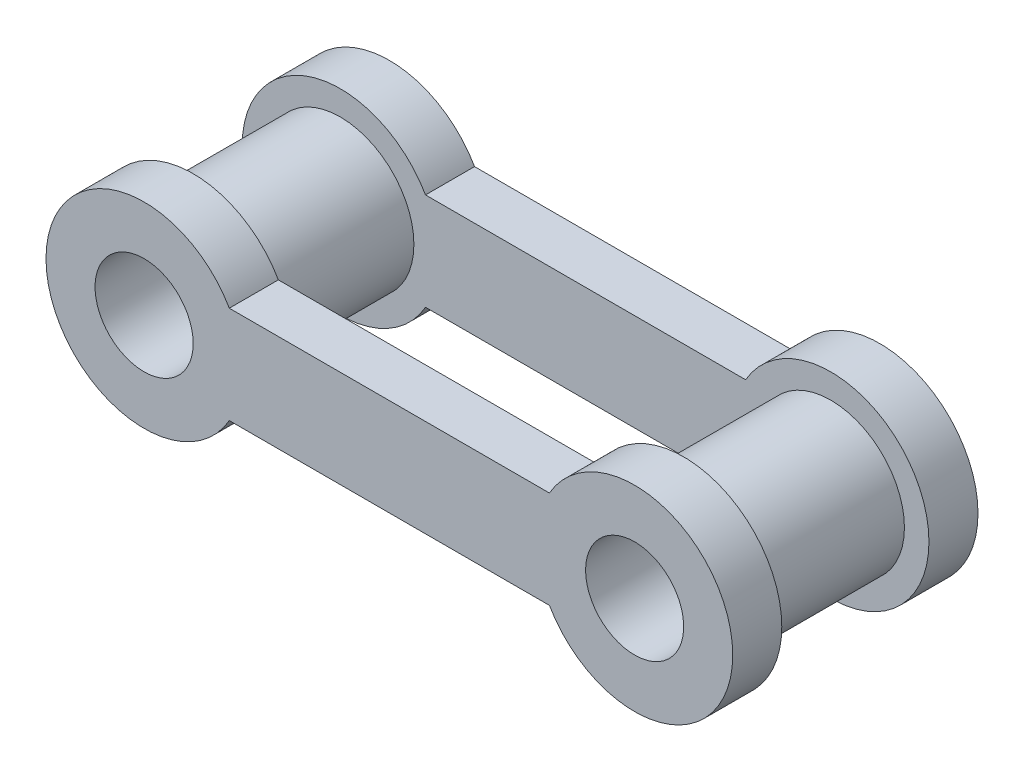
ISO-10303-21;
HEADER;
FILE_DESCRIPTION(('STEP AP214'),'2;1');
FILE_NAME('part.step','',(''),(''),'','','');
FILE_SCHEMA(('AUTOMOTIVE_DESIGN { 1 0 10303 214 1 1 1 1 }'));
ENDSEC;
DATA;
#1=APPLICATION_CONTEXT('core data for automotive mechanical design processes');
#2=APPLICATION_PROTOCOL_DEFINITION('international standard','automotive_design',2000,#1);
#3=PRODUCT_CONTEXT('',#1,'mechanical');
#4=PRODUCT('Part','Part','',(#3));
#5=PRODUCT_RELATED_PRODUCT_CATEGORY('part','',(#4));
#6=PRODUCT_DEFINITION_FORMATION('','',#4);
#7=PRODUCT_DEFINITION_CONTEXT('part definition',#1,'design');
#8=PRODUCT_DEFINITION('design','',#6,#7);
#9=PRODUCT_DEFINITION_SHAPE('','',#8);
#10=(LENGTH_UNIT() NAMED_UNIT(*) SI_UNIT(.MILLI.,.METRE.));
#11=(NAMED_UNIT(*) PLANE_ANGLE_UNIT() SI_UNIT($,.RADIAN.));
#12=(NAMED_UNIT(*) SI_UNIT($,.STERADIAN.) SOLID_ANGLE_UNIT());
#13=UNCERTAINTY_MEASURE_WITH_UNIT(LENGTH_MEASURE(1.E-05),#10,'distance_accuracy_value','');
#14=(GEOMETRIC_REPRESENTATION_CONTEXT(3) GLOBAL_UNCERTAINTY_ASSIGNED_CONTEXT((#13)) GLOBAL_UNIT_ASSIGNED_CONTEXT((#10,
#11,#12)) REPRESENTATION_CONTEXT('',''));
#15=CARTESIAN_POINT('',(0.,0.,0.));
#16=DIRECTION('',(0.,0.,1.));
#17=DIRECTION('',(1.,0.,0.));
#18=AXIS2_PLACEMENT_3D('',#15,#16,#17);
#19=CARTESIAN_POINT('',(-4.12607835068908,1.78539467495371,0.));
#20=DIRECTION('',(0.,0.,1.));
#21=DIRECTION('',(1.,0.,0.));
#22=AXIS2_PLACEMENT_3D('',#19,#20,#21);
#23=PLANE('',#22);
#24=CARTESIAN_POINT('',(15.8739216493109,1.78539467495371,0.));
#25=DIRECTION('',(0.,0.,1.));
#26=DIRECTION('',(1.,0.,0.));
#27=AXIS2_PLACEMENT_3D('',#24,#25,#26);
#28=CIRCLE('',#27,3.);
#29=CARTESIAN_POINT('',(18.8739216493109,1.78539467495371,0.));
#30=VERTEX_POINT('',#29);
#31=EDGE_CURVE('E44',#30,#30,#28,.F.);
#32=ORIENTED_EDGE('',*,*,#31,.F.);
#33=EDGE_LOOP('',(#32));
#34=FACE_BOUND('',#33,.T.);
#35=CARTESIAN_POINT('',(-4.12607835068908,1.78539467495371,0.));
#36=DIRECTION('',(0.,0.,1.));
#37=DIRECTION('',(1.,0.,0.));
#38=AXIS2_PLACEMENT_3D('',#35,#36,#37);
#39=CIRCLE('',#38,4.);
#40=CARTESIAN_POINT('',(-0.652657961034546,3.7691665360134,0.));
#41=VERTEX_POINT('',#40);
#42=CARTESIAN_POINT('',(-0.652657961034547,-0.198377186105968,0.));
#43=VERTEX_POINT('',#42);
#44=EDGE_CURVE('E167',#41,#43,#39,.T.);
#45=ORIENTED_EDGE('',*,*,#44,.F.);
#46=DIRECTION('',(-1.,0.,0.));
#47=VECTOR('',#46,1.);
#48=CARTESIAN_POINT('',(-0.652657961034546,3.7691665360134,0.));
#49=LINE('',#48,#47);
#50=CARTESIAN_POINT('',(12.4005012596564,3.7691665360134,0.));
#51=VERTEX_POINT('',#50);
#52=EDGE_CURVE('E76',#51,#41,#49,.T.);
#53=ORIENTED_EDGE('',*,*,#52,.F.);
#54=CARTESIAN_POINT('',(15.8739216493109,1.78539467495371,0.));
#55=DIRECTION('',(0.,0.,1.));
#56=DIRECTION('',(-1.,0.,0.));
#57=AXIS2_PLACEMENT_3D('',#54,#55,#56);
#58=CIRCLE('',#57,4.);
#59=CARTESIAN_POINT('',(12.4005012596564,-0.198377186105969,0.));
#60=VERTEX_POINT('',#59);
#61=EDGE_CURVE('E70',#60,#51,#58,.T.);
#62=ORIENTED_EDGE('',*,*,#61,.F.);
#63=DIRECTION('',(1.,0.,0.));
#64=VECTOR('',#63,1.);
#65=CARTESIAN_POINT('',(-0.652657961034547,-0.198377186105968,0.));
#66=LINE('',#65,#64);
#67=EDGE_CURVE('E177',#43,#60,#66,.T.);
#68=ORIENTED_EDGE('',*,*,#67,.F.);
#69=EDGE_LOOP('',(#45,#53,#62,#68));
#70=FACE_BOUND('',#69,.T.);
#71=CARTESIAN_POINT('',(-4.12607835068908,1.78539467495371,0.));
#72=DIRECTION('',(0.,0.,1.));
#73=DIRECTION('',(1.,0.,0.));
#74=AXIS2_PLACEMENT_3D('',#71,#72,#73);
#75=CIRCLE('',#74,3.);
#76=CARTESIAN_POINT('',(-1.12607835068908,1.78539467495371,0.));
#77=VERTEX_POINT('',#76);
#78=EDGE_CURVE('E11',#77,#77,#75,.F.);
#79=ORIENTED_EDGE('',*,*,#78,.F.);
#80=EDGE_LOOP('',(#79));
#81=FACE_BOUND('',#80,.T.);
#82=ADVANCED_FACE('F35',(#34,#70,#81),#23,.F.);
#83=CARTESIAN_POINT('',(-4.12607835068908,1.78539467495371,2.));
#84=DIRECTION('',(0.,0.,1.));
#85=DIRECTION('',(1.,0.,0.));
#86=AXIS2_PLACEMENT_3D('',#83,#84,#85);
#87=PLANE('',#86);
#88=CARTESIAN_POINT('',(-4.12607835068908,1.78539467495371,2.));
#89=DIRECTION('',(0.,0.,1.));
#90=DIRECTION('',(1.,0.,0.));
#91=AXIS2_PLACEMENT_3D('',#88,#89,#90);
#92=CIRCLE('',#91,2.);
#93=CARTESIAN_POINT('',(-2.12607835068908,1.78539467495371,2.));
#94=VERTEX_POINT('',#93);
#95=EDGE_CURVE('E164',#94,#94,#92,.T.);
#96=ORIENTED_EDGE('',*,*,#95,.F.);
#97=EDGE_LOOP('',(#96));
#98=FACE_BOUND('',#97,.T.);
#99=CARTESIAN_POINT('',(-4.12607835068908,1.78539467495371,2.));
#100=DIRECTION('',(0.,0.,1.));
#101=DIRECTION('',(1.,0.,0.));
#102=AXIS2_PLACEMENT_3D('',#99,#100,#101);
#103=CIRCLE('',#102,4.);
#104=CARTESIAN_POINT('',(-0.652657961034546,3.7691665360134,2.));
#105=VERTEX_POINT('',#104);
#106=CARTESIAN_POINT('',(-0.652657961034547,-0.198377186105968,2.));
#107=VERTEX_POINT('',#106);
#108=EDGE_CURVE('E168',#105,#107,#103,.T.);
#109=ORIENTED_EDGE('',*,*,#108,.T.);
#110=DIRECTION('',(1.,0.,0.));
#111=VECTOR('',#110,1.);
#112=CARTESIAN_POINT('',(-0.652657961034547,-0.198377186105968,2.));
#113=LINE('',#112,#111);
#114=CARTESIAN_POINT('',(12.4005012596564,-0.198377186105969,2.));
#115=VERTEX_POINT('',#114);
#116=EDGE_CURVE('E84',#107,#115,#113,.T.);
#117=ORIENTED_EDGE('',*,*,#116,.T.);
#118=CARTESIAN_POINT('',(15.8739216493109,1.78539467495371,2.));
#119=DIRECTION('',(0.,0.,1.));
#120=DIRECTION('',(-1.,0.,0.));
#121=AXIS2_PLACEMENT_3D('',#118,#119,#120);
#122=CIRCLE('',#121,4.);
#123=CARTESIAN_POINT('',(12.4005012596564,3.7691665360134,2.));
#124=VERTEX_POINT('',#123);
#125=EDGE_CURVE('E171',#115,#124,#122,.T.);
#126=ORIENTED_EDGE('',*,*,#125,.T.);
#127=DIRECTION('',(-1.,0.,0.));
#128=VECTOR('',#127,1.);
#129=CARTESIAN_POINT('',(-0.652657961034546,3.7691665360134,2.));
#130=LINE('',#129,#128);
#131=EDGE_CURVE('E52',#124,#105,#130,.T.);
#132=ORIENTED_EDGE('',*,*,#131,.T.);
#133=EDGE_LOOP('',(#109,#117,#126,#132));
#134=FACE_BOUND('',#133,.T.);
#135=CARTESIAN_POINT('',(15.8739216493109,1.78539467495371,2.));
#136=DIRECTION('',(0.,0.,1.));
#137=DIRECTION('',(-1.,0.,0.));
#138=AXIS2_PLACEMENT_3D('',#135,#136,#137);
#139=CIRCLE('',#138,2.);
#140=CARTESIAN_POINT('',(13.8739216493109,1.78539467495371,2.));
#141=VERTEX_POINT('',#140);
#142=EDGE_CURVE('E161',#141,#141,#139,.T.);
#143=ORIENTED_EDGE('',*,*,#142,.F.);
#144=EDGE_LOOP('',(#143));
#145=FACE_BOUND('',#144,.T.);
#146=ADVANCED_FACE('F194',(#98,#134,#145),#87,.T.);
#147=CARTESIAN_POINT('',(-4.12607835068908,1.78539467495371,2.));
#148=DIRECTION('',(0.,0.,-1.));
#149=DIRECTION('',(-1.,0.,0.));
#150=AXIS2_PLACEMENT_3D('',#147,#148,#149);
#151=CYLINDRICAL_SURFACE('',#150,4.);
#152=ORIENTED_EDGE('',*,*,#44,.T.);
#153=DIRECTION('',(0.,0.,-1.));
#154=VECTOR('',#153,1.);
#155=CARTESIAN_POINT('',(-0.652657961034547,-0.198377186105968,2.));
#156=LINE('',#155,#154);
#157=EDGE_CURVE('E186',#107,#43,#156,.T.);
#158=ORIENTED_EDGE('',*,*,#157,.F.);
#159=ORIENTED_EDGE('',*,*,#108,.F.);
#160=DIRECTION('',(0.,0.,-1.));
#161=VECTOR('',#160,1.);
#162=CARTESIAN_POINT('',(-0.652657961034546,3.7691665360134,2.));
#163=LINE('',#162,#161);
#164=EDGE_CURVE('E174',#105,#41,#163,.T.);
#165=ORIENTED_EDGE('',*,*,#164,.T.);
#166=EDGE_LOOP('',(#152,#158,#159,#165));
#167=FACE_BOUND('',#166,.T.);
#168=ADVANCED_FACE('F37',(#167),#151,.T.);
#169=CARTESIAN_POINT('',(-0.652657961034547,-0.198377186105968,2.));
#170=DIRECTION('',(0.,1.,0.));
#171=DIRECTION('',(0.,0.,1.));
#172=AXIS2_PLACEMENT_3D('',#169,#170,#171);
#173=PLANE('',#172);
#174=ORIENTED_EDGE('',*,*,#67,.T.);
#175=DIRECTION('',(0.,0.,-1.));
#176=VECTOR('',#175,1.);
#177=CARTESIAN_POINT('',(12.4005012596564,-0.198377186105969,2.));
#178=LINE('',#177,#176);
#179=EDGE_CURVE('E184',#115,#60,#178,.T.);
#180=ORIENTED_EDGE('',*,*,#179,.F.);
#181=ORIENTED_EDGE('',*,*,#116,.F.);
#182=ORIENTED_EDGE('',*,*,#157,.T.);
#183=EDGE_LOOP('',(#174,#180,#181,#182));
#184=FACE_BOUND('',#183,.T.);
#185=ADVANCED_FACE('F230',(#184),#173,.F.);
#186=CARTESIAN_POINT('',(15.8739216493109,1.78539467495371,2.));
#187=DIRECTION('',(0.,0.,-1.));
#188=DIRECTION('',(-1.,0.,0.));
#189=AXIS2_PLACEMENT_3D('',#186,#187,#188);
#190=CYLINDRICAL_SURFACE('',#189,4.);
#191=ORIENTED_EDGE('',*,*,#61,.T.);
#192=DIRECTION('',(0.,0.,-1.));
#193=VECTOR('',#192,1.);
#194=CARTESIAN_POINT('',(12.4005012596564,3.7691665360134,2.));
#195=LINE('',#194,#193);
#196=EDGE_CURVE('E182',#124,#51,#195,.T.);
#197=ORIENTED_EDGE('',*,*,#196,.F.);
#198=ORIENTED_EDGE('',*,*,#125,.F.);
#199=ORIENTED_EDGE('',*,*,#179,.T.);
#200=EDGE_LOOP('',(#191,#197,#198,#199));
#201=FACE_BOUND('',#200,.T.);
#202=ADVANCED_FACE('F228',(#201),#190,.T.);
#203=CARTESIAN_POINT('',(-0.652657961034546,3.7691665360134,2.));
#204=DIRECTION('',(0.,-1.,0.));
#205=DIRECTION('',(0.,0.,-1.));
#206=AXIS2_PLACEMENT_3D('',#203,#204,#205);
#207=PLANE('',#206);
#208=ORIENTED_EDGE('',*,*,#52,.T.);
#209=ORIENTED_EDGE('',*,*,#164,.F.);
#210=ORIENTED_EDGE('',*,*,#131,.F.);
#211=ORIENTED_EDGE('',*,*,#196,.T.);
#212=EDGE_LOOP('',(#208,#209,#210,#211));
#213=FACE_BOUND('',#212,.T.);
#214=ADVANCED_FACE('F221',(#213),#207,.F.);
#215=CARTESIAN_POINT('',(-4.12607835068908,1.78539467495371,2.));
#216=DIRECTION('',(0.,0.,-1.));
#217=DIRECTION('',(-1.,0.,0.));
#218=AXIS2_PLACEMENT_3D('',#215,#216,#217);
#219=CYLINDRICAL_SURFACE('',#218,2.);
#220=ORIENTED_EDGE('',*,*,#95,.T.);
#221=EDGE_LOOP('',(#220));
#222=FACE_BOUND('',#221,.T.);
#223=CARTESIAN_POINT('',(-4.12607835068908,1.78539467495371,-8.));
#224=DIRECTION('',(0.,0.,1.));
#225=DIRECTION('',(1.,0.,0.));
#226=AXIS2_PLACEMENT_3D('',#223,#224,#225);
#227=CIRCLE('',#226,2.);
#228=CARTESIAN_POINT('',(-2.12607835068908,1.78539467495371,-8.));
#229=VERTEX_POINT('',#228);
#230=EDGE_CURVE('E145',#229,#229,#227,.T.);
#231=ORIENTED_EDGE('',*,*,#230,.F.);
#232=EDGE_LOOP('',(#231));
#233=FACE_BOUND('',#232,.T.);
#234=ADVANCED_FACE('F217',(#222,#233),#219,.F.);
#235=CARTESIAN_POINT('',(15.8739216493109,1.78539467495371,2.));
#236=DIRECTION('',(0.,0.,-1.));
#237=DIRECTION('',(-1.,0.,0.));
#238=AXIS2_PLACEMENT_3D('',#235,#236,#237);
#239=CYLINDRICAL_SURFACE('',#238,2.);
#240=ORIENTED_EDGE('',*,*,#142,.T.);
#241=EDGE_LOOP('',(#240));
#242=FACE_BOUND('',#241,.T.);
#243=CARTESIAN_POINT('',(15.8739216493109,1.78539467495371,-8.));
#244=DIRECTION('',(0.,0.,1.));
#245=DIRECTION('',(-1.,0.,0.));
#246=AXIS2_PLACEMENT_3D('',#243,#244,#245);
#247=CIRCLE('',#246,2.);
#248=CARTESIAN_POINT('',(13.8739216493109,1.78539467495371,-8.));
#249=VERTEX_POINT('',#248);
#250=EDGE_CURVE('E244',#249,#249,#247,.T.);
#251=ORIENTED_EDGE('',*,*,#250,.F.);
#252=EDGE_LOOP('',(#251));
#253=FACE_BOUND('',#252,.T.);
#254=ADVANCED_FACE('F209',(#242,#253),#239,.F.);
#255=CARTESIAN_POINT('',(15.8739216493109,1.78539467495371,-6.));
#256=DIRECTION('',(0.,0.,1.));
#257=DIRECTION('',(1.,0.,0.));
#258=AXIS2_PLACEMENT_3D('',#255,#256,#257);
#259=CYLINDRICAL_SURFACE('',#258,3.);
#260=CARTESIAN_POINT('',(15.8739216493109,1.78539467495371,-6.));
#261=DIRECTION('',(0.,0.,-1.));
#262=DIRECTION('',(-1.,0.,0.));
#263=AXIS2_PLACEMENT_3D('',#260,#261,#262);
#264=CIRCLE('',#263,3.);
#265=CARTESIAN_POINT('',(12.8739216493109,1.78539467495371,-6.));
#266=VERTEX_POINT('',#265);
#267=EDGE_CURVE('E158',#266,#266,#264,.T.);
#268=ORIENTED_EDGE('',*,*,#267,.F.);
#269=EDGE_LOOP('',(#268));
#270=FACE_BOUND('',#269,.T.);
#271=ORIENTED_EDGE('',*,*,#31,.T.);
#272=EDGE_LOOP('',(#271));
#273=FACE_BOUND('',#272,.T.);
#274=ADVANCED_FACE('F190',(#270,#273),#259,.T.);
#275=CARTESIAN_POINT('',(-4.12607835068908,1.78539467495371,-6.));
#276=DIRECTION('',(0.,0.,1.));
#277=DIRECTION('',(1.,0.,0.));
#278=AXIS2_PLACEMENT_3D('',#275,#276,#277);
#279=CYLINDRICAL_SURFACE('',#278,3.);
#280=CARTESIAN_POINT('',(-4.12607835068908,1.78539467495371,-6.));
#281=DIRECTION('',(0.,0.,-1.));
#282=DIRECTION('',(-1.,0.,0.));
#283=AXIS2_PLACEMENT_3D('',#280,#281,#282);
#284=CIRCLE('',#283,3.);
#285=CARTESIAN_POINT('',(-7.12607835068908,1.78539467495371,-6.));
#286=VERTEX_POINT('',#285);
#287=EDGE_CURVE('E122',#286,#286,#284,.T.);
#288=ORIENTED_EDGE('',*,*,#287,.F.);
#289=EDGE_LOOP('',(#288));
#290=FACE_BOUND('',#289,.T.);
#291=ORIENTED_EDGE('',*,*,#78,.T.);
#292=EDGE_LOOP('',(#291));
#293=FACE_BOUND('',#292,.T.);
#294=ADVANCED_FACE('F200',(#290,#293),#279,.T.);
#295=CARTESIAN_POINT('',(-4.12607835068908,1.78539467495371,-8.));
#296=DIRECTION('',(0.,0.,1.));
#297=DIRECTION('',(1.,0.,0.));
#298=AXIS2_PLACEMENT_3D('',#295,#296,#297);
#299=CYLINDRICAL_SURFACE('',#298,4.);
#300=CARTESIAN_POINT('',(-4.12607835068908,1.78539467495371,-6.));
#301=DIRECTION('',(0.,0.,1.));
#302=DIRECTION('',(1.,0.,0.));
#303=AXIS2_PLACEMENT_3D('',#300,#301,#302);
#304=CIRCLE('',#303,4.);
#305=CARTESIAN_POINT('',(-0.652657961034546,3.7691665360134,-6.));
#306=VERTEX_POINT('',#305);
#307=CARTESIAN_POINT('',(-0.652657961034547,-0.198377186105968,-6.));
#308=VERTEX_POINT('',#307);
#309=EDGE_CURVE('E117',#306,#308,#304,.T.);
#310=ORIENTED_EDGE('',*,*,#309,.F.);
#311=DIRECTION('',(0.,0.,1.));
#312=VECTOR('',#311,1.);
#313=CARTESIAN_POINT('',(-0.652657961034546,3.7691665360134,-8.));
#314=LINE('',#313,#312);
#315=CARTESIAN_POINT('',(-0.652657961034546,3.7691665360134,-8.));
#316=VERTEX_POINT('',#315);
#317=EDGE_CURVE('E111',#316,#306,#314,.T.);
#318=ORIENTED_EDGE('',*,*,#317,.F.);
#319=CARTESIAN_POINT('',(-4.12607835068908,1.78539467495371,-8.));
#320=DIRECTION('',(0.,0.,1.));
#321=DIRECTION('',(1.,0.,0.));
#322=AXIS2_PLACEMENT_3D('',#319,#320,#321);
#323=CIRCLE('',#322,4.);
#324=CARTESIAN_POINT('',(-0.652657961034547,-0.198377186105968,-8.));
#325=VERTEX_POINT('',#324);
#326=EDGE_CURVE('E114',#316,#325,#323,.T.);
#327=ORIENTED_EDGE('',*,*,#326,.T.);
#328=DIRECTION('',(0.,0.,1.));
#329=VECTOR('',#328,1.);
#330=CARTESIAN_POINT('',(-0.652657961034547,-0.198377186105968,-8.));
#331=LINE('',#330,#329);
#332=EDGE_CURVE('E142',#325,#308,#331,.T.);
#333=ORIENTED_EDGE('',*,*,#332,.T.);
#334=EDGE_LOOP('',(#310,#318,#327,#333));
#335=FACE_BOUND('',#334,.T.);
#336=ADVANCED_FACE('F113',(#335),#299,.T.);
#337=CARTESIAN_POINT('',(-0.652657961034546,3.7691665360134,-8.));
#338=DIRECTION('',(0.,1.,0.));
#339=DIRECTION('',(0.,0.,1.));
#340=AXIS2_PLACEMENT_3D('',#337,#338,#339);
#341=PLANE('',#340);
#342=DIRECTION('',(-1.,0.,0.));
#343=VECTOR('',#342,1.);
#344=CARTESIAN_POINT('',(-0.652657961034546,3.7691665360134,-6.));
#345=LINE('',#344,#343);
#346=CARTESIAN_POINT('',(12.4005012596564,3.7691665360134,-6.));
#347=VERTEX_POINT('',#346);
#348=EDGE_CURVE('E144',#347,#306,#345,.T.);
#349=ORIENTED_EDGE('',*,*,#348,.F.);
#350=DIRECTION('',(0.,0.,1.));
#351=VECTOR('',#350,1.);
#352=CARTESIAN_POINT('',(12.4005012596564,3.7691665360134,-8.));
#353=LINE('',#352,#351);
#354=CARTESIAN_POINT('',(12.4005012596564,3.7691665360134,-8.));
#355=VERTEX_POINT('',#354);
#356=EDGE_CURVE('E123',#355,#347,#353,.T.);
#357=ORIENTED_EDGE('',*,*,#356,.F.);
#358=DIRECTION('',(-1.,0.,0.));
#359=VECTOR('',#358,1.);
#360=CARTESIAN_POINT('',(-0.652657961034546,3.7691665360134,-8.));
#361=LINE('',#360,#359);
#362=EDGE_CURVE('E129',#355,#316,#361,.T.);
#363=ORIENTED_EDGE('',*,*,#362,.T.);
#364=ORIENTED_EDGE('',*,*,#317,.T.);
#365=EDGE_LOOP('',(#349,#357,#363,#364));
#366=FACE_BOUND('',#365,.T.);
#367=ADVANCED_FACE('F135',(#366),#341,.T.);
#368=CARTESIAN_POINT('',(15.8739216493109,1.78539467495371,-8.));
#369=DIRECTION('',(0.,0.,1.));
#370=DIRECTION('',(1.,0.,0.));
#371=AXIS2_PLACEMENT_3D('',#368,#369,#370);
#372=CYLINDRICAL_SURFACE('',#371,4.);
#373=CARTESIAN_POINT('',(15.8739216493109,1.78539467495371,-6.));
#374=DIRECTION('',(0.,0.,1.));
#375=DIRECTION('',(-1.,0.,0.));
#376=AXIS2_PLACEMENT_3D('',#373,#374,#375);
#377=CIRCLE('',#376,4.);
#378=CARTESIAN_POINT('',(12.4005012596564,-0.198377186105969,-6.));
#379=VERTEX_POINT('',#378);
#380=EDGE_CURVE('E147',#379,#347,#377,.T.);
#381=ORIENTED_EDGE('',*,*,#380,.F.);
#382=DIRECTION('',(0.,0.,1.));
#383=VECTOR('',#382,1.);
#384=CARTESIAN_POINT('',(12.4005012596564,-0.198377186105969,-8.));
#385=LINE('',#384,#383);
#386=CARTESIAN_POINT('',(12.4005012596564,-0.198377186105969,-8.));
#387=VERTEX_POINT('',#386);
#388=EDGE_CURVE('E153',#387,#379,#385,.T.);
#389=ORIENTED_EDGE('',*,*,#388,.F.);
#390=CARTESIAN_POINT('',(15.8739216493109,1.78539467495371,-8.));
#391=DIRECTION('',(0.,0.,1.));
#392=DIRECTION('',(-1.,0.,0.));
#393=AXIS2_PLACEMENT_3D('',#390,#391,#392);
#394=CIRCLE('',#393,4.);
#395=EDGE_CURVE('E136',#387,#355,#394,.T.);
#396=ORIENTED_EDGE('',*,*,#395,.T.);
#397=ORIENTED_EDGE('',*,*,#356,.T.);
#398=EDGE_LOOP('',(#381,#389,#396,#397));
#399=FACE_BOUND('',#398,.T.);
#400=ADVANCED_FACE('F261',(#399),#372,.T.);
#401=CARTESIAN_POINT('',(-0.652657961034547,-0.198377186105968,-8.));
#402=DIRECTION('',(0.,-1.,0.));
#403=DIRECTION('',(0.,0.,-1.));
#404=AXIS2_PLACEMENT_3D('',#401,#402,#403);
#405=PLANE('',#404);
#406=DIRECTION('',(1.,0.,0.));
#407=VECTOR('',#406,1.);
#408=CARTESIAN_POINT('',(-0.652657961034547,-0.198377186105968,-6.));
#409=LINE('',#408,#407);
#410=EDGE_CURVE('E133',#308,#379,#409,.T.);
#411=ORIENTED_EDGE('',*,*,#410,.F.);
#412=ORIENTED_EDGE('',*,*,#332,.F.);
#413=DIRECTION('',(1.,0.,0.));
#414=VECTOR('',#413,1.);
#415=CARTESIAN_POINT('',(-0.652657961034547,-0.198377186105968,-8.));
#416=LINE('',#415,#414);
#417=EDGE_CURVE('E132',#325,#387,#416,.T.);
#418=ORIENTED_EDGE('',*,*,#417,.T.);
#419=ORIENTED_EDGE('',*,*,#388,.T.);
#420=EDGE_LOOP('',(#411,#412,#418,#419));
#421=FACE_BOUND('',#420,.T.);
#422=ADVANCED_FACE('F253',(#421),#405,.T.);
#423=CARTESIAN_POINT('',(-4.12607835068908,1.78539467495371,-8.));
#424=DIRECTION('',(0.,0.,-1.));
#425=DIRECTION('',(1.,0.,0.));
#426=AXIS2_PLACEMENT_3D('',#423,#424,#425);
#427=PLANE('',#426);
#428=ORIENTED_EDGE('',*,*,#250,.T.);
#429=EDGE_LOOP('',(#428));
#430=FACE_BOUND('',#429,.T.);
#431=ORIENTED_EDGE('',*,*,#230,.T.);
#432=EDGE_LOOP('',(#431));
#433=FACE_BOUND('',#432,.T.);
#434=ORIENTED_EDGE('',*,*,#326,.F.);
#435=ORIENTED_EDGE('',*,*,#362,.F.);
#436=ORIENTED_EDGE('',*,*,#395,.F.);
#437=ORIENTED_EDGE('',*,*,#417,.F.);
#438=EDGE_LOOP('',(#434,#435,#436,#437));
#439=FACE_BOUND('',#438,.T.);
#440=ADVANCED_FACE('F127',(#430,#433,#439),#427,.T.);
#441=CARTESIAN_POINT('',(-4.12607835068908,1.78539467495371,-6.));
#442=DIRECTION('',(0.,0.,-1.));
#443=DIRECTION('',(1.,0.,0.));
#444=AXIS2_PLACEMENT_3D('',#441,#442,#443);
#445=PLANE('',#444);
#446=ORIENTED_EDGE('',*,*,#267,.T.);
#447=EDGE_LOOP('',(#446));
#448=FACE_BOUND('',#447,.T.);
#449=ORIENTED_EDGE('',*,*,#287,.T.);
#450=EDGE_LOOP('',(#449));
#451=FACE_BOUND('',#450,.T.);
#452=ORIENTED_EDGE('',*,*,#309,.T.);
#453=ORIENTED_EDGE('',*,*,#410,.T.);
#454=ORIENTED_EDGE('',*,*,#380,.T.);
#455=ORIENTED_EDGE('',*,*,#348,.T.);
#456=EDGE_LOOP('',(#452,#453,#454,#455));
#457=FACE_BOUND('',#456,.T.);
#458=ADVANCED_FACE('F252',(#448,#451,#457),#445,.F.);
#459=CLOSED_SHELL('',(#82,#146,#168,#185,#202,#214,#234,#254,#274,#294,#336,#367,#400,#422,#440,#458));
#460=MANIFOLD_SOLID_BREP('B2',#459);
#461=ADVANCED_BREP_SHAPE_REPRESENTATION('',(#18,#460),#14);
#462=SHAPE_DEFINITION_REPRESENTATION(#9,#461);
ENDSEC;
END-ISO-10303-21;
